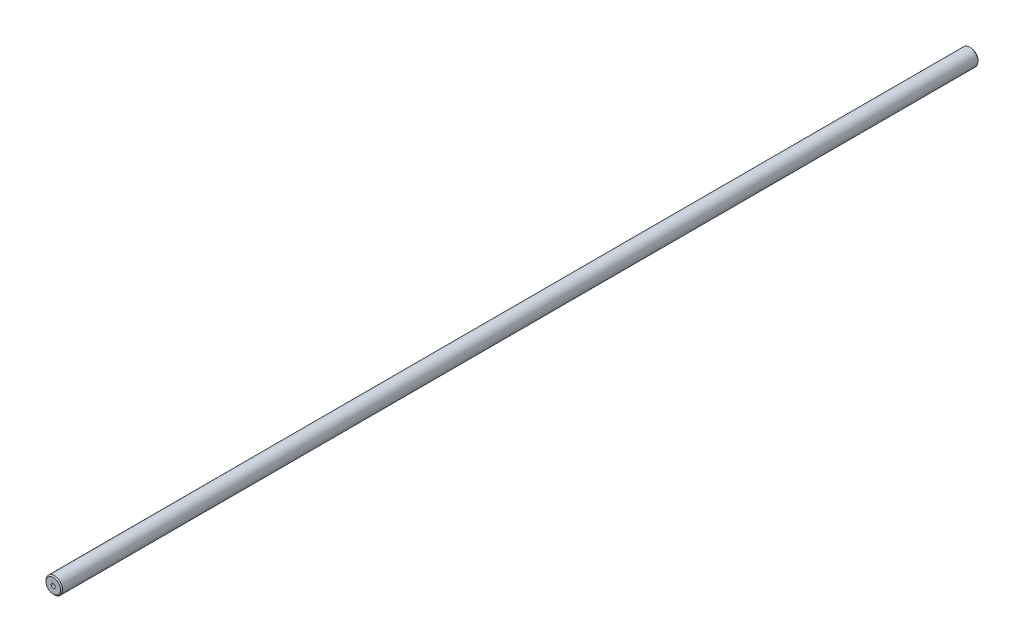
ISO-10303-21;
HEADER;
FILE_DESCRIPTION(('STEP AP214'),'2;1');
FILE_NAME('part.step','',(''),(''),'','','');
FILE_SCHEMA(('AUTOMOTIVE_DESIGN { 1 0 10303 214 1 1 1 1 }'));
ENDSEC;
DATA;
#1=APPLICATION_CONTEXT('core data for automotive mechanical design processes');
#2=APPLICATION_PROTOCOL_DEFINITION('international standard','automotive_design',2000,#1);
#3=PRODUCT_CONTEXT('',#1,'mechanical');
#4=PRODUCT('Part','Part','',(#3));
#5=PRODUCT_RELATED_PRODUCT_CATEGORY('part','',(#4));
#6=PRODUCT_DEFINITION_FORMATION('','',#4);
#7=PRODUCT_DEFINITION_CONTEXT('part definition',#1,'design');
#8=PRODUCT_DEFINITION('design','',#6,#7);
#9=PRODUCT_DEFINITION_SHAPE('','',#8);
#10=(LENGTH_UNIT() NAMED_UNIT(*) SI_UNIT(.MILLI.,.METRE.));
#11=(NAMED_UNIT(*) PLANE_ANGLE_UNIT() SI_UNIT($,.RADIAN.));
#12=(NAMED_UNIT(*) SI_UNIT($,.STERADIAN.) SOLID_ANGLE_UNIT());
#13=UNCERTAINTY_MEASURE_WITH_UNIT(LENGTH_MEASURE(1.E-05),#10,'distance_accuracy_value','');
#14=(GEOMETRIC_REPRESENTATION_CONTEXT(3) GLOBAL_UNCERTAINTY_ASSIGNED_CONTEXT((#13)) GLOBAL_UNIT_ASSIGNED_CONTEXT((#10,
#11,#12)) REPRESENTATION_CONTEXT('',''));
#15=CARTESIAN_POINT('',(0.,0.,0.));
#16=DIRECTION('',(0.,0.,1.));
#17=DIRECTION('',(1.,0.,0.));
#18=AXIS2_PLACEMENT_3D('',#15,#16,#17);
#19=CARTESIAN_POINT('',(0.,0.,441.));
#20=DIRECTION('',(0.,0.,-1.));
#21=DIRECTION('',(-1.,0.,0.));
#22=AXIS2_PLACEMENT_3D('',#19,#20,#21);
#23=CYLINDRICAL_SURFACE('',#22,4.);
#24=CARTESIAN_POINT('',(0.,0.,0.5));
#25=DIRECTION('',(0.,0.,1.));
#26=DIRECTION('',(1.,0.,0.));
#27=AXIS2_PLACEMENT_3D('',#24,#25,#26);
#28=CIRCLE('',#27,4.);
#29=CARTESIAN_POINT('',(4.,0.,0.5));
#30=VERTEX_POINT('',#29);
#31=EDGE_CURVE('E42',#30,#30,#28,.T.);
#32=ORIENTED_EDGE('',*,*,#31,.T.);
#33=EDGE_LOOP('',(#32));
#34=FACE_BOUND('',#33,.T.);
#35=CARTESIAN_POINT('',(0.,0.,440.5));
#36=DIRECTION('',(0.,0.,1.));
#37=DIRECTION('',(1.,0.,0.));
#38=AXIS2_PLACEMENT_3D('',#35,#36,#37);
#39=CIRCLE('',#38,4.);
#40=CARTESIAN_POINT('',(4.,0.,440.5));
#41=VERTEX_POINT('',#40);
#42=EDGE_CURVE('E46',#41,#41,#39,.F.);
#43=ORIENTED_EDGE('',*,*,#42,.T.);
#44=EDGE_LOOP('',(#43));
#45=FACE_BOUND('',#44,.T.);
#46=ADVANCED_FACE('F31',(#34,#45),#23,.T.);
#47=CARTESIAN_POINT('',(0.,0.,441.));
#48=DIRECTION('',(0.,0.,1.));
#49=DIRECTION('',(1.,0.,0.));
#50=AXIS2_PLACEMENT_3D('',#47,#48,#49);
#51=PLANE('',#50);
#52=CARTESIAN_POINT('',(0.,0.,441.));
#53=DIRECTION('',(0.,0.,1.));
#54=DIRECTION('',(1.,0.,0.));
#55=AXIS2_PLACEMENT_3D('',#52,#53,#54);
#56=CIRCLE('',#55,3.49999999999995);
#57=CARTESIAN_POINT('',(3.49999999999995,0.,441.));
#58=VERTEX_POINT('',#57);
#59=EDGE_CURVE('E10',#58,#58,#56,.T.);
#60=ORIENTED_EDGE('',*,*,#59,.T.);
#61=EDGE_LOOP('',(#60));
#62=FACE_BOUND('',#61,.T.);
#63=CARTESIAN_POINT('',(0.,0.,441.));
#64=DIRECTION('',(0.,0.,1.));
#65=DIRECTION('',(1.,0.,0.));
#66=AXIS2_PLACEMENT_3D('',#63,#64,#65);
#67=CIRCLE('',#66,1.);
#68=CARTESIAN_POINT('',(1.,0.,441.));
#69=VERTEX_POINT('',#68);
#70=EDGE_CURVE('E52',#69,#69,#67,.T.);
#71=ORIENTED_EDGE('',*,*,#70,.F.);
#72=EDGE_LOOP('',(#71));
#73=FACE_BOUND('',#72,.T.);
#74=ADVANCED_FACE('F67',(#62,#73),#51,.T.);
#75=CARTESIAN_POINT('',(0.,0.,0.));
#76=DIRECTION('',(0.,0.,1.));
#77=DIRECTION('',(1.,0.,0.));
#78=AXIS2_PLACEMENT_3D('',#75,#76,#77);
#79=PLANE('',#78);
#80=CARTESIAN_POINT('',(0.,0.,0.));
#81=DIRECTION('',(0.,0.,1.));
#82=DIRECTION('',(1.,0.,0.));
#83=AXIS2_PLACEMENT_3D('',#80,#81,#82);
#84=CIRCLE('',#83,3.50000000000006);
#85=CARTESIAN_POINT('',(3.50000000000006,0.,0.));
#86=VERTEX_POINT('',#85);
#87=EDGE_CURVE('E38',#86,#86,#84,.F.);
#88=ORIENTED_EDGE('',*,*,#87,.T.);
#89=EDGE_LOOP('',(#88));
#90=FACE_BOUND('',#89,.T.);
#91=ADVANCED_FACE('F63',(#90),#79,.F.);
#92=CARTESIAN_POINT('',(0.,0.,431.));
#93=DIRECTION('',(0.,0.,1.));
#94=DIRECTION('',(1.,0.,0.));
#95=AXIS2_PLACEMENT_3D('',#92,#93,#94);
#96=CYLINDRICAL_SURFACE('',#95,1.);
#97=CARTESIAN_POINT('',(0.,0.,431.));
#98=DIRECTION('',(0.,0.,1.));
#99=DIRECTION('',(1.,0.,0.));
#100=AXIS2_PLACEMENT_3D('',#97,#98,#99);
#101=CIRCLE('',#100,1.);
#102=CARTESIAN_POINT('',(1.,0.,431.));
#103=VERTEX_POINT('',#102);
#104=EDGE_CURVE('E51',#103,#103,#101,.T.);
#105=ORIENTED_EDGE('',*,*,#104,.F.);
#106=EDGE_LOOP('',(#105));
#107=FACE_BOUND('',#106,.T.);
#108=ORIENTED_EDGE('',*,*,#70,.T.);
#109=EDGE_LOOP('',(#108));
#110=FACE_BOUND('',#109,.T.);
#111=ADVANCED_FACE('F60',(#107,#110),#96,.F.);
#112=CARTESIAN_POINT('',(0.,0.,431.));
#113=DIRECTION('',(0.,0.,1.));
#114=DIRECTION('',(1.,0.,0.));
#115=AXIS2_PLACEMENT_3D('',#112,#113,#114);
#116=PLANE('',#115);
#117=ORIENTED_EDGE('',*,*,#104,.T.);
#118=EDGE_LOOP('',(#117));
#119=FACE_BOUND('',#118,.T.);
#120=ADVANCED_FACE('F58',(#119),#116,.T.);
#121=CARTESIAN_POINT('',(0.,0.,0.5));
#122=DIRECTION('',(0.,0.,1.));
#123=DIRECTION('',(1.,0.,0.));
#124=AXIS2_PLACEMENT_3D('',#121,#122,#123);
#125=CONICAL_SURFACE('',#124,4.,0.785398163397389);
#126=ORIENTED_EDGE('',*,*,#87,.F.);
#127=EDGE_LOOP('',(#126));
#128=FACE_BOUND('',#127,.T.);
#129=ORIENTED_EDGE('',*,*,#31,.F.);
#130=EDGE_LOOP('',(#129));
#131=FACE_BOUND('',#130,.T.);
#132=ADVANCED_FACE('F78',(#128,#131),#125,.T.);
#133=CARTESIAN_POINT('',(0.,0.,441.));
#134=DIRECTION('',(0.,0.,-1.));
#135=DIRECTION('',(-1.,0.,0.));
#136=AXIS2_PLACEMENT_3D('',#133,#134,#135);
#137=CONICAL_SURFACE('',#136,3.49999999999995,0.785398163397445);
#138=ORIENTED_EDGE('',*,*,#42,.F.);
#139=EDGE_LOOP('',(#138));
#140=FACE_BOUND('',#139,.T.);
#141=ORIENTED_EDGE('',*,*,#59,.F.);
#142=EDGE_LOOP('',(#141));
#143=FACE_BOUND('',#142,.T.);
#144=ADVANCED_FACE('F33',(#140,#143),#137,.T.);
#145=CLOSED_SHELL('',(#46,#74,#91,#111,#120,#132,#144));
#146=MANIFOLD_SOLID_BREP('B2',#145);
#147=ADVANCED_BREP_SHAPE_REPRESENTATION('',(#18,#146),#14);
#148=SHAPE_DEFINITION_REPRESENTATION(#9,#147);
ENDSEC;
END-ISO-10303-21;
